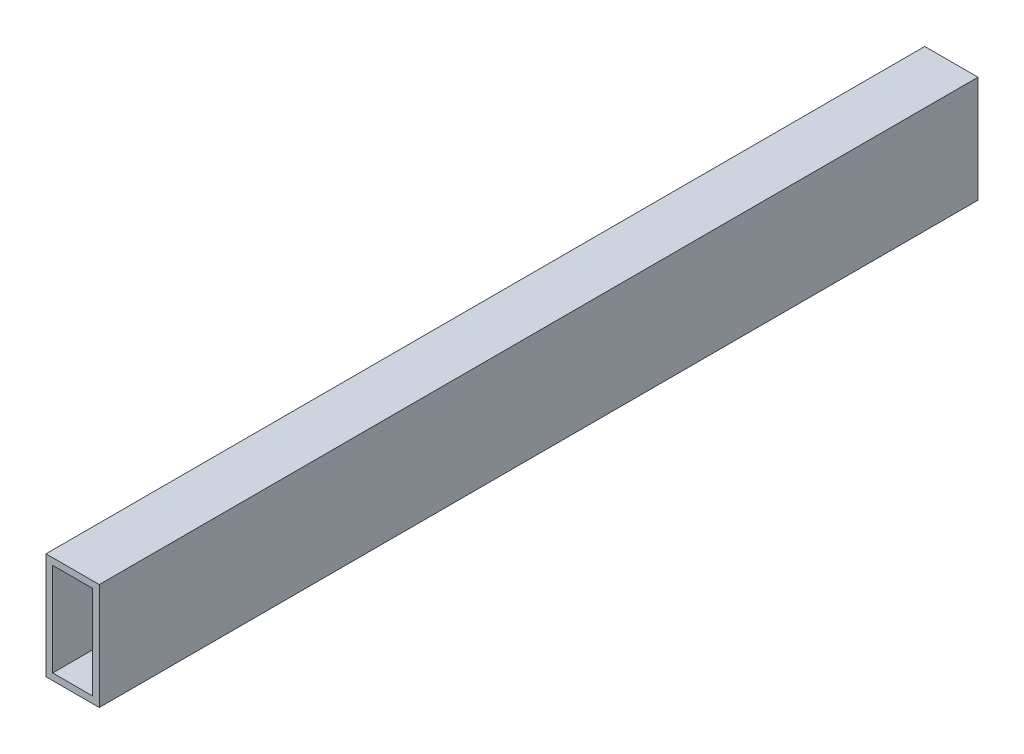
ISO-10303-21;
HEADER;
FILE_DESCRIPTION(('STEP AP214'),'2;1');
FILE_NAME('part.step','',(''),(''),'','','');
FILE_SCHEMA(('AUTOMOTIVE_DESIGN { 1 0 10303 214 1 1 1 1 }'));
ENDSEC;
DATA;
#1=APPLICATION_CONTEXT('core data for automotive mechanical design processes');
#2=APPLICATION_PROTOCOL_DEFINITION('international standard','automotive_design',2000,#1);
#3=PRODUCT_CONTEXT('',#1,'mechanical');
#4=PRODUCT('Part','Part','',(#3));
#5=PRODUCT_RELATED_PRODUCT_CATEGORY('part','',(#4));
#6=PRODUCT_DEFINITION_FORMATION('','',#4);
#7=PRODUCT_DEFINITION_CONTEXT('part definition',#1,'design');
#8=PRODUCT_DEFINITION('design','',#6,#7);
#9=PRODUCT_DEFINITION_SHAPE('','',#8);
#10=(LENGTH_UNIT() NAMED_UNIT(*) SI_UNIT(.MILLI.,.METRE.));
#11=(NAMED_UNIT(*) PLANE_ANGLE_UNIT() SI_UNIT($,.RADIAN.));
#12=(NAMED_UNIT(*) SI_UNIT($,.STERADIAN.) SOLID_ANGLE_UNIT());
#13=UNCERTAINTY_MEASURE_WITH_UNIT(LENGTH_MEASURE(1.E-05),#10,'distance_accuracy_value','');
#14=(GEOMETRIC_REPRESENTATION_CONTEXT(3) GLOBAL_UNCERTAINTY_ASSIGNED_CONTEXT((#13)) GLOBAL_UNIT_ASSIGNED_CONTEXT((#10,
#11,#12)) REPRESENTATION_CONTEXT('',''));
#15=CARTESIAN_POINT('',(0.,0.,0.));
#16=DIRECTION('',(0.,0.,1.));
#17=DIRECTION('',(1.,0.,0.));
#18=AXIS2_PLACEMENT_3D('',#15,#16,#17);
#19=CARTESIAN_POINT('',(0.,0.,419.1));
#20=DIRECTION('',(0.,0.,1.));
#21=DIRECTION('',(1.,0.,0.));
#22=AXIS2_PLACEMENT_3D('',#19,#20,#21);
#23=PLANE('',#22);
#24=DIRECTION('',(0.,1.,0.));
#25=VECTOR('',#24,1.);
#26=CARTESIAN_POINT('',(12.7,25.4,419.1));
#27=LINE('',#26,#25);
#28=CARTESIAN_POINT('',(12.7,-25.4,419.1));
#29=VERTEX_POINT('',#28);
#30=CARTESIAN_POINT('',(12.7,25.4,419.1));
#31=VERTEX_POINT('',#30);
#32=EDGE_CURVE('E142',#29,#31,#27,.T.);
#33=ORIENTED_EDGE('',*,*,#32,.T.);
#34=DIRECTION('',(-1.,0.,0.));
#35=VECTOR('',#34,1.);
#36=CARTESIAN_POINT('',(-12.7,25.4,419.1));
#37=LINE('',#36,#35);
#38=CARTESIAN_POINT('',(-12.7,25.4,419.1));
#39=VERTEX_POINT('',#38);
#40=EDGE_CURVE('E145',#31,#39,#37,.T.);
#41=ORIENTED_EDGE('',*,*,#40,.T.);
#42=DIRECTION('',(0.,-1.,0.));
#43=VECTOR('',#42,1.);
#44=CARTESIAN_POINT('',(-12.7,25.4,419.1));
#45=LINE('',#44,#43);
#46=CARTESIAN_POINT('',(-12.7,-25.4,419.1));
#47=VERTEX_POINT('',#46);
#48=EDGE_CURVE('E148',#39,#47,#45,.T.);
#49=ORIENTED_EDGE('',*,*,#48,.T.);
#50=DIRECTION('',(1.,0.,0.));
#51=VECTOR('',#50,1.);
#52=CARTESIAN_POINT('',(-12.7,-25.4,419.1));
#53=LINE('',#52,#51);
#54=EDGE_CURVE('E150',#47,#29,#53,.T.);
#55=ORIENTED_EDGE('',*,*,#54,.T.);
#56=EDGE_LOOP('',(#33,#41,#49,#55));
#57=FACE_BOUND('',#56,.T.);
#58=DIRECTION('',(-1.,0.,0.));
#59=VECTOR('',#58,1.);
#60=CARTESIAN_POINT('',(-9.525,22.225,419.1));
#61=LINE('',#60,#59);
#62=CARTESIAN_POINT('',(9.525,22.225,419.1));
#63=VERTEX_POINT('',#62);
#64=CARTESIAN_POINT('',(-9.525,22.225,419.1));
#65=VERTEX_POINT('',#64);
#66=EDGE_CURVE('E114',#63,#65,#61,.T.);
#67=ORIENTED_EDGE('',*,*,#66,.F.);
#68=DIRECTION('',(0.,1.,0.));
#69=VECTOR('',#68,1.);
#70=CARTESIAN_POINT('',(9.525,22.225,419.1));
#71=LINE('',#70,#69);
#72=CARTESIAN_POINT('',(9.525,-22.225,419.1));
#73=VERTEX_POINT('',#72);
#74=EDGE_CURVE('E106',#73,#63,#71,.T.);
#75=ORIENTED_EDGE('',*,*,#74,.F.);
#76=DIRECTION('',(1.,0.,0.));
#77=VECTOR('',#76,1.);
#78=CARTESIAN_POINT('',(-9.525,-22.225,419.1));
#79=LINE('',#78,#77);
#80=CARTESIAN_POINT('',(-9.525,-22.225,419.1));
#81=VERTEX_POINT('',#80);
#82=EDGE_CURVE('E128',#81,#73,#79,.T.);
#83=ORIENTED_EDGE('',*,*,#82,.F.);
#84=DIRECTION('',(0.,-1.,0.));
#85=VECTOR('',#84,1.);
#86=CARTESIAN_POINT('',(-9.525,22.225,419.1));
#87=LINE('',#86,#85);
#88=EDGE_CURVE('E126',#65,#81,#87,.T.);
#89=ORIENTED_EDGE('',*,*,#88,.F.);
#90=EDGE_LOOP('',(#67,#75,#83,#89));
#91=FACE_BOUND('',#90,.T.);
#92=ADVANCED_FACE('F41',(#57,#91),#23,.T.);
#93=CARTESIAN_POINT('',(0.,0.,0.));
#94=DIRECTION('',(0.,0.,1.));
#95=DIRECTION('',(1.,0.,0.));
#96=AXIS2_PLACEMENT_3D('',#93,#94,#95);
#97=PLANE('',#96);
#98=DIRECTION('',(0.,1.,0.));
#99=VECTOR('',#98,1.);
#100=CARTESIAN_POINT('',(12.7,25.4,0.));
#101=LINE('',#100,#99);
#102=CARTESIAN_POINT('',(12.7,-25.4,0.));
#103=VERTEX_POINT('',#102);
#104=CARTESIAN_POINT('',(12.7,25.4,0.));
#105=VERTEX_POINT('',#104);
#106=EDGE_CURVE('E122',#103,#105,#101,.T.);
#107=ORIENTED_EDGE('',*,*,#106,.F.);
#108=DIRECTION('',(1.,0.,0.));
#109=VECTOR('',#108,1.);
#110=CARTESIAN_POINT('',(-12.7,-25.4,0.));
#111=LINE('',#110,#109);
#112=CARTESIAN_POINT('',(-12.7,-25.4,0.));
#113=VERTEX_POINT('',#112);
#114=EDGE_CURVE('E146',#113,#103,#111,.T.);
#115=ORIENTED_EDGE('',*,*,#114,.F.);
#116=DIRECTION('',(0.,-1.,0.));
#117=VECTOR('',#116,1.);
#118=CARTESIAN_POINT('',(-12.7,25.4,0.));
#119=LINE('',#118,#117);
#120=CARTESIAN_POINT('',(-12.7,25.4,0.));
#121=VERTEX_POINT('',#120);
#122=EDGE_CURVE('E157',#121,#113,#119,.T.);
#123=ORIENTED_EDGE('',*,*,#122,.F.);
#124=DIRECTION('',(-1.,0.,0.));
#125=VECTOR('',#124,1.);
#126=CARTESIAN_POINT('',(-12.7,25.4,0.));
#127=LINE('',#126,#125);
#128=EDGE_CURVE('E155',#105,#121,#127,.T.);
#129=ORIENTED_EDGE('',*,*,#128,.F.);
#130=EDGE_LOOP('',(#107,#115,#123,#129));
#131=FACE_BOUND('',#130,.T.);
#132=DIRECTION('',(0.,1.,0.));
#133=VECTOR('',#132,1.);
#134=CARTESIAN_POINT('',(9.525,22.225,0.));
#135=LINE('',#134,#133);
#136=CARTESIAN_POINT('',(9.525,-22.225,0.));
#137=VERTEX_POINT('',#136);
#138=CARTESIAN_POINT('',(9.525,22.225,0.));
#139=VERTEX_POINT('',#138);
#140=EDGE_CURVE('E64',#137,#139,#135,.T.);
#141=ORIENTED_EDGE('',*,*,#140,.T.);
#142=DIRECTION('',(-1.,0.,0.));
#143=VECTOR('',#142,1.);
#144=CARTESIAN_POINT('',(-9.525,22.225,0.));
#145=LINE('',#144,#143);
#146=CARTESIAN_POINT('',(-9.525,22.225,0.));
#147=VERTEX_POINT('',#146);
#148=EDGE_CURVE('E121',#139,#147,#145,.T.);
#149=ORIENTED_EDGE('',*,*,#148,.T.);
#150=DIRECTION('',(0.,-1.,0.));
#151=VECTOR('',#150,1.);
#152=CARTESIAN_POINT('',(-9.525,22.225,0.));
#153=LINE('',#152,#151);
#154=CARTESIAN_POINT('',(-9.525,-22.225,0.));
#155=VERTEX_POINT('',#154);
#156=EDGE_CURVE('E134',#147,#155,#153,.T.);
#157=ORIENTED_EDGE('',*,*,#156,.T.);
#158=DIRECTION('',(1.,0.,0.));
#159=VECTOR('',#158,1.);
#160=CARTESIAN_POINT('',(-9.525,-22.225,0.));
#161=LINE('',#160,#159);
#162=EDGE_CURVE('E115',#155,#137,#161,.T.);
#163=ORIENTED_EDGE('',*,*,#162,.T.);
#164=EDGE_LOOP('',(#141,#149,#157,#163));
#165=FACE_BOUND('',#164,.T.);
#166=ADVANCED_FACE('F175',(#131,#165),#97,.F.);
#167=CARTESIAN_POINT('',(12.7,25.4,419.1));
#168=DIRECTION('',(-1.,0.,0.));
#169=DIRECTION('',(0.,-1.,0.));
#170=AXIS2_PLACEMENT_3D('',#167,#168,#169);
#171=PLANE('',#170);
#172=ORIENTED_EDGE('',*,*,#106,.T.);
#173=DIRECTION('',(0.,0.,-1.));
#174=VECTOR('',#173,1.);
#175=CARTESIAN_POINT('',(12.7,25.4,419.1));
#176=LINE('',#175,#174);
#177=EDGE_CURVE('E11',#31,#105,#176,.T.);
#178=ORIENTED_EDGE('',*,*,#177,.F.);
#179=ORIENTED_EDGE('',*,*,#32,.F.);
#180=DIRECTION('',(0.,0.,-1.));
#181=VECTOR('',#180,1.);
#182=CARTESIAN_POINT('',(12.7,-25.4,419.1));
#183=LINE('',#182,#181);
#184=EDGE_CURVE('E152',#29,#103,#183,.T.);
#185=ORIENTED_EDGE('',*,*,#184,.T.);
#186=EDGE_LOOP('',(#172,#178,#179,#185));
#187=FACE_BOUND('',#186,.T.);
#188=ADVANCED_FACE('F43',(#187),#171,.F.);
#189=CARTESIAN_POINT('',(-12.7,25.4,419.1));
#190=DIRECTION('',(0.,-1.,0.));
#191=DIRECTION('',(0.,0.,-1.));
#192=AXIS2_PLACEMENT_3D('',#189,#190,#191);
#193=PLANE('',#192);
#194=ORIENTED_EDGE('',*,*,#128,.T.);
#195=DIRECTION('',(0.,0.,-1.));
#196=VECTOR('',#195,1.);
#197=CARTESIAN_POINT('',(-12.7,25.4,419.1));
#198=LINE('',#197,#196);
#199=EDGE_CURVE('E49',#39,#121,#198,.T.);
#200=ORIENTED_EDGE('',*,*,#199,.F.);
#201=ORIENTED_EDGE('',*,*,#40,.F.);
#202=ORIENTED_EDGE('',*,*,#177,.T.);
#203=EDGE_LOOP('',(#194,#200,#201,#202));
#204=FACE_BOUND('',#203,.T.);
#205=ADVANCED_FACE('F185',(#204),#193,.F.);
#206=CARTESIAN_POINT('',(-12.7,25.4,419.1));
#207=DIRECTION('',(1.,0.,0.));
#208=DIRECTION('',(0.,1.,0.));
#209=AXIS2_PLACEMENT_3D('',#206,#207,#208);
#210=PLANE('',#209);
#211=ORIENTED_EDGE('',*,*,#122,.T.);
#212=DIRECTION('',(0.,0.,-1.));
#213=VECTOR('',#212,1.);
#214=CARTESIAN_POINT('',(-12.7,-25.4,419.1));
#215=LINE('',#214,#213);
#216=EDGE_CURVE('E162',#47,#113,#215,.T.);
#217=ORIENTED_EDGE('',*,*,#216,.F.);
#218=ORIENTED_EDGE('',*,*,#48,.F.);
#219=ORIENTED_EDGE('',*,*,#199,.T.);
#220=EDGE_LOOP('',(#211,#217,#218,#219));
#221=FACE_BOUND('',#220,.T.);
#222=ADVANCED_FACE('F169',(#221),#210,.F.);
#223=CARTESIAN_POINT('',(-12.7,-25.4,419.1));
#224=DIRECTION('',(0.,1.,0.));
#225=DIRECTION('',(-1.,0.,0.));
#226=AXIS2_PLACEMENT_3D('',#223,#224,#225);
#227=PLANE('',#226);
#228=ORIENTED_EDGE('',*,*,#114,.T.);
#229=ORIENTED_EDGE('',*,*,#184,.F.);
#230=ORIENTED_EDGE('',*,*,#54,.F.);
#231=ORIENTED_EDGE('',*,*,#216,.T.);
#232=EDGE_LOOP('',(#228,#229,#230,#231));
#233=FACE_BOUND('',#232,.T.);
#234=ADVANCED_FACE('F179',(#233),#227,.F.);
#235=CARTESIAN_POINT('',(9.525,22.225,419.1));
#236=DIRECTION('',(-1.,0.,0.));
#237=DIRECTION('',(0.,0.,1.));
#238=AXIS2_PLACEMENT_3D('',#235,#236,#237);
#239=PLANE('',#238);
#240=ORIENTED_EDGE('',*,*,#140,.F.);
#241=DIRECTION('',(0.,0.,-1.));
#242=VECTOR('',#241,1.);
#243=CARTESIAN_POINT('',(9.525,-22.225,419.1));
#244=LINE('',#243,#242);
#245=EDGE_CURVE('E110',#73,#137,#244,.T.);
#246=ORIENTED_EDGE('',*,*,#245,.F.);
#247=ORIENTED_EDGE('',*,*,#74,.T.);
#248=DIRECTION('',(0.,0.,-1.));
#249=VECTOR('',#248,1.);
#250=CARTESIAN_POINT('',(9.525,22.225,419.1));
#251=LINE('',#250,#249);
#252=EDGE_CURVE('E109',#63,#139,#251,.T.);
#253=ORIENTED_EDGE('',*,*,#252,.T.);
#254=EDGE_LOOP('',(#240,#246,#247,#253));
#255=FACE_BOUND('',#254,.T.);
#256=ADVANCED_FACE('F108',(#255),#239,.T.);
#257=CARTESIAN_POINT('',(-9.525,22.225,419.1));
#258=DIRECTION('',(0.,-1.,0.));
#259=DIRECTION('',(1.,0.,0.));
#260=AXIS2_PLACEMENT_3D('',#257,#258,#259);
#261=PLANE('',#260);
#262=ORIENTED_EDGE('',*,*,#148,.F.);
#263=ORIENTED_EDGE('',*,*,#252,.F.);
#264=ORIENTED_EDGE('',*,*,#66,.T.);
#265=DIRECTION('',(0.,0.,-1.));
#266=VECTOR('',#265,1.);
#267=CARTESIAN_POINT('',(-9.525,22.225,419.1));
#268=LINE('',#267,#266);
#269=EDGE_CURVE('E123',#65,#147,#268,.T.);
#270=ORIENTED_EDGE('',*,*,#269,.T.);
#271=EDGE_LOOP('',(#262,#263,#264,#270));
#272=FACE_BOUND('',#271,.T.);
#273=ADVANCED_FACE('F118',(#272),#261,.T.);
#274=CARTESIAN_POINT('',(-9.525,22.225,419.1));
#275=DIRECTION('',(1.,0.,0.));
#276=DIRECTION('',(0.,1.,0.));
#277=AXIS2_PLACEMENT_3D('',#274,#275,#276);
#278=PLANE('',#277);
#279=ORIENTED_EDGE('',*,*,#156,.F.);
#280=ORIENTED_EDGE('',*,*,#269,.F.);
#281=ORIENTED_EDGE('',*,*,#88,.T.);
#282=DIRECTION('',(0.,0.,-1.));
#283=VECTOR('',#282,1.);
#284=CARTESIAN_POINT('',(-9.525,-22.225,419.1));
#285=LINE('',#284,#283);
#286=EDGE_CURVE('E56',#81,#155,#285,.T.);
#287=ORIENTED_EDGE('',*,*,#286,.T.);
#288=EDGE_LOOP('',(#279,#280,#281,#287));
#289=FACE_BOUND('',#288,.T.);
#290=ADVANCED_FACE('F208',(#289),#278,.T.);
#291=CARTESIAN_POINT('',(-9.525,-22.225,419.1));
#292=DIRECTION('',(0.,1.,0.));
#293=DIRECTION('',(0.,0.,1.));
#294=AXIS2_PLACEMENT_3D('',#291,#292,#293);
#295=PLANE('',#294);
#296=ORIENTED_EDGE('',*,*,#162,.F.);
#297=ORIENTED_EDGE('',*,*,#286,.F.);
#298=ORIENTED_EDGE('',*,*,#82,.T.);
#299=ORIENTED_EDGE('',*,*,#245,.T.);
#300=EDGE_LOOP('',(#296,#297,#298,#299));
#301=FACE_BOUND('',#300,.T.);
#302=ADVANCED_FACE('F212',(#301),#295,.T.);
#303=CLOSED_SHELL('',(#92,#166,#188,#205,#222,#234,#256,#273,#290,#302));
#304=MANIFOLD_SOLID_BREP('B2',#303);
#305=ADVANCED_BREP_SHAPE_REPRESENTATION('',(#18,#304),#14);
#306=SHAPE_DEFINITION_REPRESENTATION(#9,#305);
ENDSEC;
END-ISO-10303-21;
